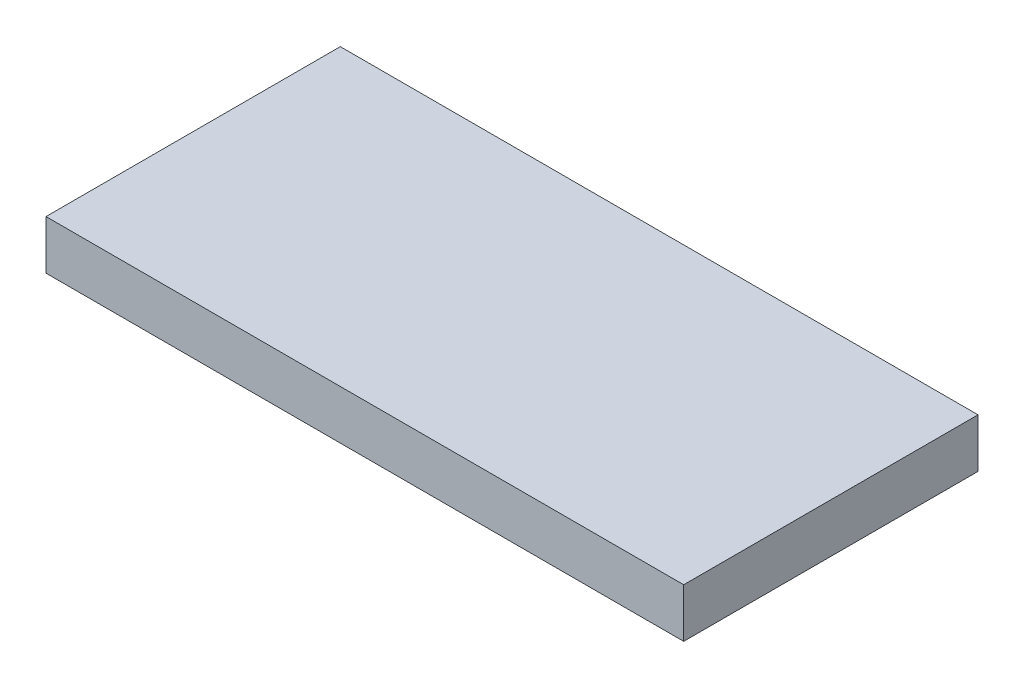
ISO-10303-21;
HEADER;
FILE_DESCRIPTION(('STEP AP214'),'2;1');
FILE_NAME('part.step','',(''),(''),'','','');
FILE_SCHEMA(('AUTOMOTIVE_DESIGN { 1 0 10303 214 1 1 1 1 }'));
ENDSEC;
DATA;
#1=APPLICATION_CONTEXT('core data for automotive mechanical design processes');
#2=APPLICATION_PROTOCOL_DEFINITION('international standard','automotive_design',2000,#1);
#3=PRODUCT_CONTEXT('',#1,'mechanical');
#4=PRODUCT('Part','Part','',(#3));
#5=PRODUCT_RELATED_PRODUCT_CATEGORY('part','',(#4));
#6=PRODUCT_DEFINITION_FORMATION('','',#4);
#7=PRODUCT_DEFINITION_CONTEXT('part definition',#1,'design');
#8=PRODUCT_DEFINITION('design','',#6,#7);
#9=PRODUCT_DEFINITION_SHAPE('','',#8);
#10=(LENGTH_UNIT() NAMED_UNIT(*) SI_UNIT(.MILLI.,.METRE.));
#11=(NAMED_UNIT(*) PLANE_ANGLE_UNIT() SI_UNIT($,.RADIAN.));
#12=(NAMED_UNIT(*) SI_UNIT($,.STERADIAN.) SOLID_ANGLE_UNIT());
#13=UNCERTAINTY_MEASURE_WITH_UNIT(LENGTH_MEASURE(1.E-05),#10,'distance_accuracy_value','');
#14=(GEOMETRIC_REPRESENTATION_CONTEXT(3) GLOBAL_UNCERTAINTY_ASSIGNED_CONTEXT((#13)) GLOBAL_UNIT_ASSIGNED_CONTEXT((#10,
#11,#12)) REPRESENTATION_CONTEXT('',''));
#15=CARTESIAN_POINT('',(0.,0.,0.));
#16=DIRECTION('',(0.,0.,1.));
#17=DIRECTION('',(1.,0.,0.));
#18=AXIS2_PLACEMENT_3D('',#15,#16,#17);
#19=CARTESIAN_POINT('',(0.,5.,0.));
#20=DIRECTION('',(-1.,0.,0.));
#21=DIRECTION('',(0.,0.,1.));
#22=AXIS2_PLACEMENT_3D('',#19,#20,#21);
#23=PLANE('',#22);
#24=DIRECTION('',(0.,0.,-1.));
#25=VECTOR('',#24,1.);
#26=CARTESIAN_POINT('',(0.,0.,0.));
#27=LINE('',#26,#25);
#28=CARTESIAN_POINT('',(0.,0.,30.));
#29=VERTEX_POINT('',#28);
#30=CARTESIAN_POINT('',(0.,0.,0.));
#31=VERTEX_POINT('',#30);
#32=EDGE_CURVE('E113',#29,#31,#27,.T.);
#33=ORIENTED_EDGE('',*,*,#32,.T.);
#34=DIRECTION('',(0.,-1.,0.));
#35=VECTOR('',#34,1.);
#36=CARTESIAN_POINT('',(0.,5.,0.));
#37=LINE('',#36,#35);
#38=CARTESIAN_POINT('',(0.,5.,0.));
#39=VERTEX_POINT('',#38);
#40=EDGE_CURVE('E11',#39,#31,#37,.T.);
#41=ORIENTED_EDGE('',*,*,#40,.F.);
#42=DIRECTION('',(0.,0.,-1.));
#43=VECTOR('',#42,1.);
#44=CARTESIAN_POINT('',(0.,5.,0.));
#45=LINE('',#44,#43);
#46=CARTESIAN_POINT('',(0.,5.,30.));
#47=VERTEX_POINT('',#46);
#48=EDGE_CURVE('E97',#47,#39,#45,.T.);
#49=ORIENTED_EDGE('',*,*,#48,.F.);
#50=DIRECTION('',(0.,-1.,0.));
#51=VECTOR('',#50,1.);
#52=CARTESIAN_POINT('',(0.,5.,30.));
#53=LINE('',#52,#51);
#54=EDGE_CURVE('E109',#47,#29,#53,.T.);
#55=ORIENTED_EDGE('',*,*,#54,.T.);
#56=EDGE_LOOP('',(#33,#41,#49,#55));
#57=FACE_BOUND('',#56,.T.);
#58=ADVANCED_FACE('F45',(#57),#23,.F.);
#59=CARTESIAN_POINT('',(0.,5.,0.));
#60=DIRECTION('',(0.,0.,1.));
#61=DIRECTION('',(1.,0.,0.));
#62=AXIS2_PLACEMENT_3D('',#59,#60,#61);
#63=PLANE('',#62);
#64=DIRECTION('',(-1.,0.,0.));
#65=VECTOR('',#64,1.);
#66=CARTESIAN_POINT('',(0.,0.,0.));
#67=LINE('',#66,#65);
#68=CARTESIAN_POINT('',(-65.,0.,0.));
#69=VERTEX_POINT('',#68);
#70=EDGE_CURVE('E102',#31,#69,#67,.T.);
#71=ORIENTED_EDGE('',*,*,#70,.T.);
#72=DIRECTION('',(0.,-1.,0.));
#73=VECTOR('',#72,1.);
#74=CARTESIAN_POINT('',(-65.,5.,0.));
#75=LINE('',#74,#73);
#76=CARTESIAN_POINT('',(-65.,5.,0.));
#77=VERTEX_POINT('',#76);
#78=EDGE_CURVE('E54',#77,#69,#75,.T.);
#79=ORIENTED_EDGE('',*,*,#78,.F.);
#80=DIRECTION('',(-1.,0.,0.));
#81=VECTOR('',#80,1.);
#82=CARTESIAN_POINT('',(0.,5.,0.));
#83=LINE('',#82,#81);
#84=EDGE_CURVE('E92',#39,#77,#83,.T.);
#85=ORIENTED_EDGE('',*,*,#84,.F.);
#86=ORIENTED_EDGE('',*,*,#40,.T.);
#87=EDGE_LOOP('',(#71,#79,#85,#86));
#88=FACE_BOUND('',#87,.T.);
#89=ADVANCED_FACE('F101',(#88),#63,.F.);
#90=CARTESIAN_POINT('',(-65.,5.,0.));
#91=DIRECTION('',(1.,0.,0.));
#92=DIRECTION('',(0.,0.,-1.));
#93=AXIS2_PLACEMENT_3D('',#90,#91,#92);
#94=PLANE('',#93);
#95=DIRECTION('',(0.,0.,1.));
#96=VECTOR('',#95,1.);
#97=CARTESIAN_POINT('',(-65.,0.,0.));
#98=LINE('',#97,#96);
#99=CARTESIAN_POINT('',(-65.,0.,30.));
#100=VERTEX_POINT('',#99);
#101=EDGE_CURVE('E79',#69,#100,#98,.T.);
#102=ORIENTED_EDGE('',*,*,#101,.T.);
#103=DIRECTION('',(0.,-1.,0.));
#104=VECTOR('',#103,1.);
#105=CARTESIAN_POINT('',(-65.,5.,30.));
#106=LINE('',#105,#104);
#107=CARTESIAN_POINT('',(-65.,5.,30.));
#108=VERTEX_POINT('',#107);
#109=EDGE_CURVE('E104',#108,#100,#106,.T.);
#110=ORIENTED_EDGE('',*,*,#109,.F.);
#111=DIRECTION('',(0.,0.,1.));
#112=VECTOR('',#111,1.);
#113=CARTESIAN_POINT('',(-65.,5.,0.));
#114=LINE('',#113,#112);
#115=EDGE_CURVE('E95',#77,#108,#114,.T.);
#116=ORIENTED_EDGE('',*,*,#115,.F.);
#117=ORIENTED_EDGE('',*,*,#78,.T.);
#118=EDGE_LOOP('',(#102,#110,#116,#117));
#119=FACE_BOUND('',#118,.T.);
#120=ADVANCED_FACE('F105',(#119),#94,.F.);
#121=CARTESIAN_POINT('',(0.,5.,30.));
#122=DIRECTION('',(0.,0.,-1.));
#123=DIRECTION('',(-1.,0.,0.));
#124=AXIS2_PLACEMENT_3D('',#121,#122,#123);
#125=PLANE('',#124);
#126=DIRECTION('',(1.,0.,0.));
#127=VECTOR('',#126,1.);
#128=CARTESIAN_POINT('',(0.,0.,30.));
#129=LINE('',#128,#127);
#130=EDGE_CURVE('E85',#100,#29,#129,.T.);
#131=ORIENTED_EDGE('',*,*,#130,.T.);
#132=ORIENTED_EDGE('',*,*,#54,.F.);
#133=DIRECTION('',(1.,0.,0.));
#134=VECTOR('',#133,1.);
#135=CARTESIAN_POINT('',(0.,5.,30.));
#136=LINE('',#135,#134);
#137=EDGE_CURVE('E62',#108,#47,#136,.T.);
#138=ORIENTED_EDGE('',*,*,#137,.F.);
#139=ORIENTED_EDGE('',*,*,#109,.T.);
#140=EDGE_LOOP('',(#131,#132,#138,#139));
#141=FACE_BOUND('',#140,.T.);
#142=ADVANCED_FACE('F126',(#141),#125,.F.);
#143=CARTESIAN_POINT('',(0.,5.,0.));
#144=DIRECTION('',(0.,-1.,0.));
#145=DIRECTION('',(0.,0.,-1.));
#146=AXIS2_PLACEMENT_3D('',#143,#144,#145);
#147=PLANE('',#146);
#148=ORIENTED_EDGE('',*,*,#48,.T.);
#149=ORIENTED_EDGE('',*,*,#84,.T.);
#150=ORIENTED_EDGE('',*,*,#115,.T.);
#151=ORIENTED_EDGE('',*,*,#137,.T.);
#152=EDGE_LOOP('',(#148,#149,#150,#151));
#153=FACE_BOUND('',#152,.T.);
#154=ADVANCED_FACE('F93',(#153),#147,.F.);
#155=CARTESIAN_POINT('',(0.,0.,0.));
#156=DIRECTION('',(0.,-1.,0.));
#157=DIRECTION('',(0.,0.,-1.));
#158=AXIS2_PLACEMENT_3D('',#155,#156,#157);
#159=PLANE('',#158);
#160=ORIENTED_EDGE('',*,*,#32,.F.);
#161=ORIENTED_EDGE('',*,*,#130,.F.);
#162=ORIENTED_EDGE('',*,*,#101,.F.);
#163=ORIENTED_EDGE('',*,*,#70,.F.);
#164=EDGE_LOOP('',(#160,#161,#162,#163));
#165=FACE_BOUND('',#164,.T.);
#166=ADVANCED_FACE('F129',(#165),#159,.T.);
#167=CLOSED_SHELL('',(#58,#89,#120,#142,#154,#166));
#168=MANIFOLD_SOLID_BREP('B2',#167);
#169=ADVANCED_BREP_SHAPE_REPRESENTATION('',(#18,#168),#14);
#170=SHAPE_DEFINITION_REPRESENTATION(#9,#169);
ENDSEC;
END-ISO-10303-21;
